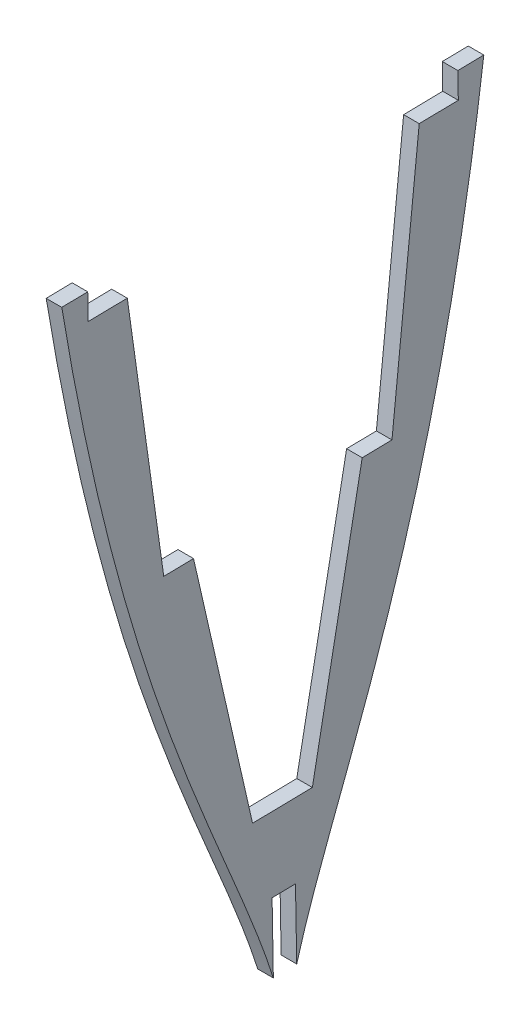
ISO-10303-21;
HEADER;
FILE_DESCRIPTION(('STEP AP214'),'2;1');
FILE_NAME('part.step','',(''),(''),'','','');
FILE_SCHEMA(('AUTOMOTIVE_DESIGN { 1 0 10303 214 1 1 1 1 }'));
ENDSEC;
DATA;
#1=APPLICATION_CONTEXT('core data for automotive mechanical design processes');
#2=APPLICATION_PROTOCOL_DEFINITION('international standard','automotive_design',2000,#1);
#3=PRODUCT_CONTEXT('',#1,'mechanical');
#4=PRODUCT('Part','Part','',(#3));
#5=PRODUCT_RELATED_PRODUCT_CATEGORY('part','',(#4));
#6=PRODUCT_DEFINITION_FORMATION('','',#4);
#7=PRODUCT_DEFINITION_CONTEXT('part definition',#1,'design');
#8=PRODUCT_DEFINITION('design','',#6,#7);
#9=PRODUCT_DEFINITION_SHAPE('','',#8);
#10=(LENGTH_UNIT() NAMED_UNIT(*) SI_UNIT(.MILLI.,.METRE.));
#11=(NAMED_UNIT(*) PLANE_ANGLE_UNIT() SI_UNIT($,.RADIAN.));
#12=(NAMED_UNIT(*) SI_UNIT($,.STERADIAN.) SOLID_ANGLE_UNIT());
#13=UNCERTAINTY_MEASURE_WITH_UNIT(LENGTH_MEASURE(1.E-05),#10,'distance_accuracy_value','');
#14=(GEOMETRIC_REPRESENTATION_CONTEXT(3) GLOBAL_UNCERTAINTY_ASSIGNED_CONTEXT((#13)) GLOBAL_UNIT_ASSIGNED_CONTEXT((#10,
#11,#12)) REPRESENTATION_CONTEXT('',''));
#15=CARTESIAN_POINT('',(0.,0.,0.));
#16=DIRECTION('',(0.,0.,1.));
#17=DIRECTION('',(1.,0.,0.));
#18=AXIS2_PLACEMENT_3D('',#15,#16,#17);
#19=CARTESIAN_POINT('',(6.,89.6041586149967,1.58905888744342));
#20=CARTESIAN_POINT('',(6.,148.754134114083,-8.60867994160897));
#21=CARTESIAN_POINT('',(6.,203.619351527145,-52.3294000676424));
#22=CARTESIAN_POINT('',(6.,374.992738115061,-74.6183258739251));
#23=B_SPLINE_CURVE_WITH_KNOTS('',3,(#19,#20,#21,#22),.UNSPECIFIED.,.F.,.F.,(4,4),(0.,1.),.UNSPECIFIED.);
#24=DIRECTION('',(-1.,0.,0.));
#25=VECTOR('',#24,1.);
#26=SURFACE_OF_LINEAR_EXTRUSION('',#23,#25);
#27=CARTESIAN_POINT('',(6.,107.940325521315,-2.58647126833044));
#28=VERTEX_POINT('',#27);
#29=CARTESIAN_POINT('',(6.,374.992738115061,-74.6183258739251));
#30=VERTEX_POINT('',#29);
#31=EDGE_CURVE('E116',#28,#30,#23,.T.);
#32=ORIENTED_EDGE('',*,*,#31,.F.);
#33=DIRECTION('',(1.,0.,0.));
#34=VECTOR('',#33,1.);
#35=CARTESIAN_POINT('',(0.,107.940325521315,-2.58647126833044));
#36=LINE('',#35,#34);
#37=CARTESIAN_POINT('',(0.,107.940325521315,-2.58647126833044));
#38=VERTEX_POINT('',#37);
#39=EDGE_CURVE('E377',#38,#28,#36,.T.);
#40=ORIENTED_EDGE('',*,*,#39,.F.);
#41=CARTESIAN_POINT('',(0.,89.6041586149967,1.58905888744342));
#42=CARTESIAN_POINT('',(0.,148.754134114083,-8.60867994160897));
#43=CARTESIAN_POINT('',(0.,203.619351527145,-52.3294000676424));
#44=CARTESIAN_POINT('',(0.,374.992738115061,-74.6183258739251));
#45=B_SPLINE_CURVE_WITH_KNOTS('',3,(#41,#42,#43,#44),.UNSPECIFIED.,.F.,.F.,(4,4),(0.,1.),.UNSPECIFIED.);
#46=CARTESIAN_POINT('',(0.,374.992738115061,-74.6183258739251));
#47=VERTEX_POINT('',#46);
#48=EDGE_CURVE('E185',#38,#47,#45,.T.);
#49=ORIENTED_EDGE('',*,*,#48,.T.);
#50=DIRECTION('',(-1.,0.,0.));
#51=VECTOR('',#50,1.);
#52=CARTESIAN_POINT('',(6.,374.992738115061,-74.6183258739251));
#53=LINE('',#52,#51);
#54=EDGE_CURVE('E11',#30,#47,#53,.T.);
#55=ORIENTED_EDGE('',*,*,#54,.F.);
#56=EDGE_LOOP('',(#32,#40,#49,#55));
#57=FACE_BOUND('',#56,.T.);
#58=ADVANCED_FACE('F33',(#57),#26,.F.);
#59=CARTESIAN_POINT('',(6.,374.992738115061,-74.6183258739251));
#60=DIRECTION('',(0.,-0.999842785995474,-0.0177314210600299));
#61=DIRECTION('',(0.,0.0177314210600299,-0.999842785995474));
#62=AXIS2_PLACEMENT_3D('',#59,#60,#61);
#63=PLANE('',#62);
#64=DIRECTION('',(0.,-0.0177314210600299,0.999842785995474));
#65=VECTOR('',#64,1.);
#66=CARTESIAN_POINT('',(0.,374.992738115061,-74.6183258739251));
#67=LINE('',#66,#65);
#68=CARTESIAN_POINT('',(0.,374.815423904461,-64.6198980139703));
#69=VERTEX_POINT('',#68);
#70=EDGE_CURVE('E251',#47,#69,#67,.T.);
#71=ORIENTED_EDGE('',*,*,#70,.T.);
#72=DIRECTION('',(-1.,0.,0.));
#73=VECTOR('',#72,1.);
#74=CARTESIAN_POINT('',(6.,374.815423904461,-64.6198980139703));
#75=LINE('',#74,#73);
#76=CARTESIAN_POINT('',(6.,374.815423904461,-64.6198980139703));
#77=VERTEX_POINT('',#76);
#78=EDGE_CURVE('E41',#77,#69,#75,.T.);
#79=ORIENTED_EDGE('',*,*,#78,.F.);
#80=DIRECTION('',(0.,-0.0177314210600299,0.999842785995474));
#81=VECTOR('',#80,1.);
#82=CARTESIAN_POINT('',(6.,374.992738115061,-74.6183258739251));
#83=LINE('',#82,#81);
#84=EDGE_CURVE('E327',#30,#77,#83,.T.);
#85=ORIENTED_EDGE('',*,*,#84,.F.);
#86=ORIENTED_EDGE('',*,*,#54,.T.);
#87=EDGE_LOOP('',(#71,#79,#85,#86));
#88=FACE_BOUND('',#87,.T.);
#89=ADVANCED_FACE('F241',(#88),#63,.F.);
#90=CARTESIAN_POINT('',(6.,374.815423904461,-64.6198980139703));
#91=DIRECTION('',(0.,0.0177314210600324,-0.999842785995474));
#92=DIRECTION('',(0.,0.999842785995474,0.0177314210600324));
#93=AXIS2_PLACEMENT_3D('',#90,#91,#92);
#94=PLANE('',#93);
#95=DIRECTION('',(0.,-0.999842785995474,-0.0177314210600324));
#96=VECTOR('',#95,1.);
#97=CARTESIAN_POINT('',(0.,374.815423904461,-64.6198980139703));
#98=LINE('',#97,#96);
#99=CARTESIAN_POINT('',(0.,364.815423904461,-64.797240105231));
#100=VERTEX_POINT('',#99);
#101=EDGE_CURVE('E258',#69,#100,#98,.T.);
#102=ORIENTED_EDGE('',*,*,#101,.T.);
#103=DIRECTION('',(-1.,0.,0.));
#104=VECTOR('',#103,1.);
#105=CARTESIAN_POINT('',(6.,364.815423904461,-64.797240105231));
#106=LINE('',#105,#104);
#107=CARTESIAN_POINT('',(6.,364.815423904461,-64.797240105231));
#108=VERTEX_POINT('',#107);
#109=EDGE_CURVE('E262',#108,#100,#106,.T.);
#110=ORIENTED_EDGE('',*,*,#109,.F.);
#111=DIRECTION('',(0.,-0.999842785995474,-0.0177314210600324));
#112=VECTOR('',#111,1.);
#113=CARTESIAN_POINT('',(6.,374.815423904461,-64.6198980139703));
#114=LINE('',#113,#112);
#115=EDGE_CURVE('E261',#77,#108,#114,.T.);
#116=ORIENTED_EDGE('',*,*,#115,.F.);
#117=ORIENTED_EDGE('',*,*,#78,.T.);
#118=EDGE_LOOP('',(#102,#110,#116,#117));
#119=FACE_BOUND('',#118,.T.);
#120=ADVANCED_FACE('F238',(#119),#94,.F.);
#121=CARTESIAN_POINT('',(6.,364.815423904461,-64.797240105231));
#122=DIRECTION('',(0.,-0.999842785995474,-0.01773142106003));
#123=DIRECTION('',(0.,0.01773142106003,-0.999842785995474));
#124=AXIS2_PLACEMENT_3D('',#121,#122,#123);
#125=PLANE('',#124);
#126=DIRECTION('',(0.,-0.01773142106003,0.999842785995474));
#127=VECTOR('',#126,1.);
#128=CARTESIAN_POINT('',(0.,364.815423904461,-64.797240105231));
#129=LINE('',#128,#127);
#130=CARTESIAN_POINT('',(0.,364.548482313517,-49.7448862592683));
#131=VERTEX_POINT('',#130);
#132=EDGE_CURVE('E265',#100,#131,#129,.T.);
#133=ORIENTED_EDGE('',*,*,#132,.T.);
#134=DIRECTION('',(-1.,0.,0.));
#135=VECTOR('',#134,1.);
#136=CARTESIAN_POINT('',(6.,364.548482313517,-49.7448862592683));
#137=LINE('',#136,#135);
#138=CARTESIAN_POINT('',(6.,364.548482313517,-49.7448862592683));
#139=VERTEX_POINT('',#138);
#140=EDGE_CURVE('E316',#139,#131,#137,.T.);
#141=ORIENTED_EDGE('',*,*,#140,.F.);
#142=DIRECTION('',(0.,-0.01773142106003,0.999842785995474));
#143=VECTOR('',#142,1.);
#144=CARTESIAN_POINT('',(6.,364.815423904461,-64.797240105231));
#145=LINE('',#144,#143);
#146=EDGE_CURVE('E321',#108,#139,#145,.T.);
#147=ORIENTED_EDGE('',*,*,#146,.F.);
#148=ORIENTED_EDGE('',*,*,#109,.T.);
#149=EDGE_LOOP('',(#133,#141,#147,#148));
#150=FACE_BOUND('',#149,.T.);
#151=ADVANCED_FACE('F234',(#150),#125,.F.);
#152=CARTESIAN_POINT('',(6.,364.548482313517,-49.7448862592683));
#153=DIRECTION('',(0.,-0.104133257989715,-0.994563353728885));
#154=DIRECTION('',(0.,0.994563353728885,-0.104133257989715));
#155=AXIS2_PLACEMENT_3D('',#152,#153,#154);
#156=PLANE('',#155);
#157=DIRECTION('',(0.,-0.994563353728885,0.104133257989715));
#158=VECTOR('',#157,1.);
#159=CARTESIAN_POINT('',(0.,364.548482313517,-49.7448862592683));
#160=LINE('',#159,#158);
#161=CARTESIAN_POINT('',(0.,264.346702190025,-39.2535105399567));
#162=VERTEX_POINT('',#161);
#163=EDGE_CURVE('E267',#131,#162,#160,.T.);
#164=ORIENTED_EDGE('',*,*,#163,.T.);
#165=DIRECTION('',(-1.,0.,0.));
#166=VECTOR('',#165,1.);
#167=CARTESIAN_POINT('',(6.,264.346702190025,-39.2535105399567));
#168=LINE('',#167,#166);
#169=CARTESIAN_POINT('',(6.,264.346702190025,-39.2535105399567));
#170=VERTEX_POINT('',#169);
#171=EDGE_CURVE('E313',#170,#162,#168,.T.);
#172=ORIENTED_EDGE('',*,*,#171,.F.);
#173=DIRECTION('',(0.,-0.994563353728885,0.104133257989715));
#174=VECTOR('',#173,1.);
#175=CARTESIAN_POINT('',(6.,364.548482313517,-49.7448862592683));
#176=LINE('',#175,#174);
#177=EDGE_CURVE('E323',#139,#170,#176,.T.);
#178=ORIENTED_EDGE('',*,*,#177,.F.);
#179=ORIENTED_EDGE('',*,*,#140,.T.);
#180=EDGE_LOOP('',(#164,#172,#178,#179));
#181=FACE_BOUND('',#180,.T.);
#182=ADVANCED_FACE('F230',(#181),#156,.F.);
#183=CARTESIAN_POINT('',(6.,264.346702190025,-39.2535105399567));
#184=DIRECTION('',(0.,-0.999842785995474,-0.0177314210600326));
#185=DIRECTION('',(0.,0.0177314210600326,-0.999842785995474));
#186=AXIS2_PLACEMENT_3D('',#183,#184,#185);
#187=PLANE('',#186);
#188=DIRECTION('',(0.,-0.0177314210600326,0.999842785995474));
#189=VECTOR('',#188,1.);
#190=CARTESIAN_POINT('',(0.,264.346702190025,-39.2535105399567));
#191=LINE('',#190,#189);
#192=CARTESIAN_POINT('',(0.,264.143438531371,-27.7918402050227));
#193=VERTEX_POINT('',#192);
#194=EDGE_CURVE('E271',#162,#193,#191,.T.);
#195=ORIENTED_EDGE('',*,*,#194,.T.);
#196=DIRECTION('',(-1.,0.,0.));
#197=VECTOR('',#196,1.);
#198=CARTESIAN_POINT('',(6.,264.143438531371,-27.7918402050227));
#199=LINE('',#198,#197);
#200=CARTESIAN_POINT('',(6.,264.143438531371,-27.7918402050227));
#201=VERTEX_POINT('',#200);
#202=EDGE_CURVE('E310',#201,#193,#199,.T.);
#203=ORIENTED_EDGE('',*,*,#202,.F.);
#204=DIRECTION('',(0.,-0.0177314210600326,0.999842785995474));
#205=VECTOR('',#204,1.);
#206=CARTESIAN_POINT('',(6.,264.346702190025,-39.2535105399567));
#207=LINE('',#206,#205);
#208=EDGE_CURVE('E325',#170,#201,#207,.T.);
#209=ORIENTED_EDGE('',*,*,#208,.F.);
#210=ORIENTED_EDGE('',*,*,#171,.T.);
#211=EDGE_LOOP('',(#195,#203,#209,#210));
#212=FACE_BOUND('',#211,.T.);
#213=ADVANCED_FACE('F226',(#212),#187,.F.);
#214=CARTESIAN_POINT('',(6.,264.143438531371,-27.7918402050227));
#215=DIRECTION('',(0.,-0.187751911637469,-0.9822164831016));
#216=DIRECTION('',(0.,0.9822164831016,-0.187751911637469));
#217=AXIS2_PLACEMENT_3D('',#214,#215,#216);
#218=PLANE('',#217);
#219=DIRECTION('',(0.,-0.9822164831016,0.187751911637469));
#220=VECTOR('',#219,1.);
#221=CARTESIAN_POINT('',(0.,264.143438531371,-27.7918402050227));
#222=LINE('',#221,#220);
#223=CARTESIAN_POINT('',(0.,163.787516483096,-8.60867994160897));
#224=VERTEX_POINT('',#223);
#225=EDGE_CURVE('E273',#193,#224,#222,.T.);
#226=ORIENTED_EDGE('',*,*,#225,.T.);
#227=DIRECTION('',(-1.,0.,0.));
#228=VECTOR('',#227,1.);
#229=CARTESIAN_POINT('',(6.,163.787516483096,-8.60867994160897));
#230=LINE('',#229,#228);
#231=CARTESIAN_POINT('',(6.,163.787516483096,-8.60867994160897));
#232=VERTEX_POINT('',#231);
#233=EDGE_CURVE('E307',#232,#224,#230,.T.);
#234=ORIENTED_EDGE('',*,*,#233,.F.);
#235=DIRECTION('',(0.,-0.9822164831016,0.187751911637469));
#236=VECTOR('',#235,1.);
#237=CARTESIAN_POINT('',(6.,264.143438531371,-27.7918402050227));
#238=LINE('',#237,#236);
#239=EDGE_CURVE('E332',#201,#232,#238,.T.);
#240=ORIENTED_EDGE('',*,*,#239,.F.);
#241=ORIENTED_EDGE('',*,*,#202,.T.);
#242=EDGE_LOOP('',(#226,#234,#240,#241));
#243=FACE_BOUND('',#242,.T.);
#244=ADVANCED_FACE('F222',(#243),#218,.F.);
#245=CARTESIAN_POINT('',(6.,163.787516483096,-8.60867994160897));
#246=DIRECTION('',(0.,-0.999842785995474,-0.0177314210600294));
#247=DIRECTION('',(0.,0.0177314210600294,-0.999842785995474));
#248=AXIS2_PLACEMENT_3D('',#245,#246,#247);
#249=PLANE('',#248);
#250=DIRECTION('',(0.,-0.0177314210600294,0.999842785995474));
#251=VECTOR('',#250,1.);
#252=CARTESIAN_POINT('',(0.,163.787516483096,-8.60867994160897));
#253=LINE('',#252,#251);
#254=CARTESIAN_POINT('',(0.,163.379285552047,14.410724428006));
#255=VERTEX_POINT('',#254);
#256=EDGE_CURVE('E275',#224,#255,#253,.T.);
#257=ORIENTED_EDGE('',*,*,#256,.T.);
#258=DIRECTION('',(-1.,0.,0.));
#259=VECTOR('',#258,1.);
#260=CARTESIAN_POINT('',(6.,163.379285552047,14.410724428006));
#261=LINE('',#260,#259);
#262=CARTESIAN_POINT('',(6.,163.379285552047,14.410724428006));
#263=VERTEX_POINT('',#262);
#264=EDGE_CURVE('E304',#263,#255,#261,.T.);
#265=ORIENTED_EDGE('',*,*,#264,.F.);
#266=DIRECTION('',(0.,-0.0177314210600294,0.999842785995474));
#267=VECTOR('',#266,1.);
#268=CARTESIAN_POINT('',(6.,163.787516483096,-8.60867994160897));
#269=LINE('',#268,#267);
#270=EDGE_CURVE('E334',#232,#263,#269,.T.);
#271=ORIENTED_EDGE('',*,*,#270,.F.);
#272=ORIENTED_EDGE('',*,*,#233,.T.);
#273=EDGE_LOOP('',(#257,#265,#271,#272));
#274=FACE_BOUND('',#273,.T.);
#275=ADVANCED_FACE('F218',(#274),#249,.F.);
#276=CARTESIAN_POINT('',(6.,262.991920702867,37.1401689034259));
#277=DIRECTION('',(0.,-0.222460563959151,0.974941689273249));
#278=DIRECTION('',(0.,-0.974941689273249,-0.222460563959151));
#279=AXIS2_PLACEMENT_3D('',#276,#277,#278);
#280=PLANE('',#279);
#281=DIRECTION('',(0.,0.974941689273249,0.222460563959151));
#282=VECTOR('',#281,1.);
#283=CARTESIAN_POINT('',(0.,262.991920702867,37.1401689034259));
#284=LINE('',#283,#282);
#285=CARTESIAN_POINT('',(0.,262.991920702867,37.1401689034259));
#286=VERTEX_POINT('',#285);
#287=EDGE_CURVE('E277',#255,#286,#284,.T.);
#288=ORIENTED_EDGE('',*,*,#287,.T.);
#289=DIRECTION('',(-1.,0.,0.));
#290=VECTOR('',#289,1.);
#291=CARTESIAN_POINT('',(6.,262.991920702867,37.1401689034259));
#292=LINE('',#291,#290);
#293=CARTESIAN_POINT('',(6.,262.991920702867,37.1401689034259));
#294=VERTEX_POINT('',#293);
#295=EDGE_CURVE('E301',#294,#286,#292,.T.);
#296=ORIENTED_EDGE('',*,*,#295,.F.);
#297=DIRECTION('',(0.,0.974941689273249,0.222460563959151));
#298=VECTOR('',#297,1.);
#299=CARTESIAN_POINT('',(6.,262.991920702867,37.1401689034259));
#300=LINE('',#299,#298);
#301=EDGE_CURVE('E336',#263,#294,#300,.T.);
#302=ORIENTED_EDGE('',*,*,#301,.F.);
#303=ORIENTED_EDGE('',*,*,#264,.T.);
#304=EDGE_LOOP('',(#288,#296,#302,#303));
#305=FACE_BOUND('',#304,.T.);
#306=ADVANCED_FACE('F214',(#305),#280,.F.);
#307=CARTESIAN_POINT('',(6.,262.788657044213,48.60183923836));
#308=DIRECTION('',(0.,-0.999842785995474,-0.0177314210600326));
#309=DIRECTION('',(0.,0.0177314210600326,-0.999842785995474));
#310=AXIS2_PLACEMENT_3D('',#307,#308,#309);
#311=PLANE('',#310);
#312=DIRECTION('',(0.,-0.0177314210600326,0.999842785995474));
#313=VECTOR('',#312,1.);
#314=CARTESIAN_POINT('',(0.,262.788657044213,48.60183923836));
#315=LINE('',#314,#313);
#316=CARTESIAN_POINT('',(0.,262.788657044213,48.60183923836));
#317=VERTEX_POINT('',#316);
#318=EDGE_CURVE('E279',#286,#317,#315,.T.);
#319=ORIENTED_EDGE('',*,*,#318,.T.);
#320=DIRECTION('',(-1.,0.,0.));
#321=VECTOR('',#320,1.);
#322=CARTESIAN_POINT('',(6.,262.788657044213,48.60183923836));
#323=LINE('',#322,#321);
#324=CARTESIAN_POINT('',(6.,262.788657044213,48.60183923836));
#325=VERTEX_POINT('',#324);
#326=EDGE_CURVE('E298',#325,#317,#323,.T.);
#327=ORIENTED_EDGE('',*,*,#326,.F.);
#328=DIRECTION('',(0.,-0.0177314210600326,0.999842785995474));
#329=VECTOR('',#328,1.);
#330=CARTESIAN_POINT('',(6.,262.788657044213,48.60183923836));
#331=LINE('',#330,#329);
#332=EDGE_CURVE('E338',#294,#325,#331,.T.);
#333=ORIENTED_EDGE('',*,*,#332,.F.);
#334=ORIENTED_EDGE('',*,*,#295,.T.);
#335=EDGE_LOOP('',(#319,#327,#333,#334));
#336=FACE_BOUND('',#335,.T.);
#337=ADVANCED_FACE('F210',(#336),#311,.F.);
#338=CARTESIAN_POINT('',(6.,362.555434119816,62.6394991696776));
#339=DIRECTION('',(0.,-0.139332276558265,0.990245685024222));
#340=DIRECTION('',(0.,-0.990245685024222,-0.139332276558265));
#341=AXIS2_PLACEMENT_3D('',#338,#339,#340);
#342=PLANE('',#341);
#343=DIRECTION('',(0.,0.990245685024222,0.139332276558265));
#344=VECTOR('',#343,1.);
#345=CARTESIAN_POINT('',(0.,362.555434119816,62.6394991696776));
#346=LINE('',#345,#344);
#347=CARTESIAN_POINT('',(0.,362.555434119816,62.6394991696776));
#348=VERTEX_POINT('',#347);
#349=EDGE_CURVE('E281',#317,#348,#346,.T.);
#350=ORIENTED_EDGE('',*,*,#349,.T.);
#351=DIRECTION('',(-1.,0.,0.));
#352=VECTOR('',#351,1.);
#353=CARTESIAN_POINT('',(6.,362.555434119816,62.6394991696776));
#354=LINE('',#353,#352);
#355=CARTESIAN_POINT('',(6.,362.555434119816,62.6394991696776));
#356=VERTEX_POINT('',#355);
#357=EDGE_CURVE('E171',#356,#348,#354,.T.);
#358=ORIENTED_EDGE('',*,*,#357,.F.);
#359=DIRECTION('',(0.,0.990245685024222,0.139332276558265));
#360=VECTOR('',#359,1.);
#361=CARTESIAN_POINT('',(6.,362.555434119816,62.6394991696776));
#362=LINE('',#361,#360);
#363=EDGE_CURVE('E159',#325,#356,#362,.T.);
#364=ORIENTED_EDGE('',*,*,#363,.F.);
#365=ORIENTED_EDGE('',*,*,#326,.T.);
#366=EDGE_LOOP('',(#350,#358,#364,#365));
#367=FACE_BOUND('',#366,.T.);
#368=ADVANCED_FACE('F207',(#367),#342,.F.);
#369=CARTESIAN_POINT('',(6.,362.288492528872,77.6918530156404));
#370=DIRECTION('',(0.,-0.999842785995474,-0.0177314210600374));
#371=DIRECTION('',(0.,0.0177314210600374,-0.999842785995474));
#372=AXIS2_PLACEMENT_3D('',#369,#370,#371);
#373=PLANE('',#372);
#374=DIRECTION('',(0.,-0.0177314210600374,0.999842785995474));
#375=VECTOR('',#374,1.);
#376=CARTESIAN_POINT('',(0.,362.288492528872,77.6918530156404));
#377=LINE('',#376,#375);
#378=CARTESIAN_POINT('',(0.,362.288492528872,77.6918530156404));
#379=VERTEX_POINT('',#378);
#380=EDGE_CURVE('E168',#348,#379,#377,.T.);
#381=ORIENTED_EDGE('',*,*,#380,.T.);
#382=DIRECTION('',(-1.,0.,0.));
#383=VECTOR('',#382,1.);
#384=CARTESIAN_POINT('',(6.,362.288492528872,77.6918530156404));
#385=LINE('',#384,#383);
#386=CARTESIAN_POINT('',(6.,362.288492528872,77.6918530156404));
#387=VERTEX_POINT('',#386);
#388=EDGE_CURVE('E165',#387,#379,#385,.T.);
#389=ORIENTED_EDGE('',*,*,#388,.F.);
#390=DIRECTION('',(0.,-0.0177314210600374,0.999842785995474));
#391=VECTOR('',#390,1.);
#392=CARTESIAN_POINT('',(6.,362.288492528872,77.6918530156404));
#393=LINE('',#392,#391);
#394=EDGE_CURVE('E151',#356,#387,#393,.T.);
#395=ORIENTED_EDGE('',*,*,#394,.F.);
#396=ORIENTED_EDGE('',*,*,#357,.T.);
#397=EDGE_LOOP('',(#381,#389,#395,#396));
#398=FACE_BOUND('',#397,.T.);
#399=ADVANCED_FACE('F166',(#398),#373,.F.);
#400=CARTESIAN_POINT('',(6.,372.288492528872,77.869195106901));
#401=DIRECTION('',(0.,-0.0177314210600269,0.999842785995474));
#402=DIRECTION('',(0.,-0.999842785995474,-0.0177314210600269));
#403=AXIS2_PLACEMENT_3D('',#400,#401,#402);
#404=PLANE('',#403);
#405=DIRECTION('',(0.,0.999842785995475,0.0177314210600269));
#406=VECTOR('',#405,1.);
#407=CARTESIAN_POINT('',(0.,372.288492528872,77.869195106901));
#408=LINE('',#407,#406);
#409=CARTESIAN_POINT('',(0.,372.288492528872,77.869195106901));
#410=VERTEX_POINT('',#409);
#411=EDGE_CURVE('E284',#379,#410,#408,.T.);
#412=ORIENTED_EDGE('',*,*,#411,.T.);
#413=DIRECTION('',(-1.,0.,0.));
#414=VECTOR('',#413,1.);
#415=CARTESIAN_POINT('',(6.,372.288492528872,77.869195106901));
#416=LINE('',#415,#414);
#417=CARTESIAN_POINT('',(6.,372.288492528872,77.869195106901));
#418=VERTEX_POINT('',#417);
#419=EDGE_CURVE('E172',#418,#410,#416,.T.);
#420=ORIENTED_EDGE('',*,*,#419,.F.);
#421=DIRECTION('',(0.,0.999842785995475,0.0177314210600269));
#422=VECTOR('',#421,1.);
#423=CARTESIAN_POINT('',(6.,372.288492528872,77.869195106901));
#424=LINE('',#423,#422);
#425=EDGE_CURVE('E156',#387,#418,#424,.T.);
#426=ORIENTED_EDGE('',*,*,#425,.F.);
#427=ORIENTED_EDGE('',*,*,#388,.T.);
#428=EDGE_LOOP('',(#412,#420,#426,#427));
#429=FACE_BOUND('',#428,.T.);
#430=ADVANCED_FACE('F174',(#429),#404,.F.);
#431=CARTESIAN_POINT('',(6.,372.111178318272,87.8676229668557));
#432=DIRECTION('',(0.,-0.999842785995474,-0.0177314210600299));
#433=DIRECTION('',(0.,0.0177314210600299,-0.999842785995474));
#434=AXIS2_PLACEMENT_3D('',#431,#432,#433);
#435=PLANE('',#434);
#436=DIRECTION('',(0.,-0.0177314210600299,0.999842785995474));
#437=VECTOR('',#436,1.);
#438=CARTESIAN_POINT('',(0.,372.111178318272,87.8676229668557));
#439=LINE('',#438,#437);
#440=CARTESIAN_POINT('',(0.,372.111178318272,87.8676229668557));
#441=VERTEX_POINT('',#440);
#442=EDGE_CURVE('E108',#410,#441,#439,.T.);
#443=ORIENTED_EDGE('',*,*,#442,.T.);
#444=DIRECTION('',(-1.,0.,0.));
#445=VECTOR('',#444,1.);
#446=CARTESIAN_POINT('',(6.,372.111178318272,87.8676229668557));
#447=LINE('',#446,#445);
#448=CARTESIAN_POINT('',(6.,372.111178318272,87.8676229668557));
#449=VERTEX_POINT('',#448);
#450=EDGE_CURVE('E184',#449,#441,#447,.T.);
#451=ORIENTED_EDGE('',*,*,#450,.F.);
#452=DIRECTION('',(0.,-0.0177314210600299,0.999842785995474));
#453=VECTOR('',#452,1.);
#454=CARTESIAN_POINT('',(6.,372.111178318272,87.8676229668557));
#455=LINE('',#454,#453);
#456=EDGE_CURVE('E57',#418,#449,#455,.T.);
#457=ORIENTED_EDGE('',*,*,#456,.F.);
#458=ORIENTED_EDGE('',*,*,#419,.T.);
#459=EDGE_LOOP('',(#443,#451,#457,#458));
#460=FACE_BOUND('',#459,.T.);
#461=ADVANCED_FACE('F197',(#460),#435,.F.);
#462=CARTESIAN_POINT('',(6.,372.111178318272,87.8676229668557));
#463=CARTESIAN_POINT('',(6.,201.635856834881,59.5162806821615));
#464=CARTESIAN_POINT('',(6.,148.355356272873,13.8776817774697));
#465=CARTESIAN_POINT('',(6.,89.6041586149967,1.58905888744342));
#466=B_SPLINE_CURVE_WITH_KNOTS('',3,(#462,#463,#464,#465),.UNSPECIFIED.,.F.,.F.,(4,4),(0.,1.),.UNSPECIFIED.);
#467=DIRECTION('',(-1.,0.,0.));
#468=VECTOR('',#467,1.);
#469=SURFACE_OF_LINEAR_EXTRUSION('',#466,#468);
#470=CARTESIAN_POINT('',(0.,372.111178318272,87.8676229668557));
#471=CARTESIAN_POINT('',(0.,201.635856834881,59.5162806821615));
#472=CARTESIAN_POINT('',(0.,148.355356272873,13.8776817774697));
#473=CARTESIAN_POINT('',(0.,89.6041586149967,1.58905888744342));
#474=B_SPLINE_CURVE_WITH_KNOTS('',3,(#470,#471,#472,#473),.UNSPECIFIED.,.F.,.F.,(4,4),(0.,1.),.UNSPECIFIED.);
#475=CARTESIAN_POINT('',(0.,107.780742731775,6.41211380562883));
#476=VERTEX_POINT('',#475);
#477=EDGE_CURVE('E287',#441,#476,#474,.T.);
#478=ORIENTED_EDGE('',*,*,#477,.T.);
#479=DIRECTION('',(1.,0.,0.));
#480=VECTOR('',#479,1.);
#481=CARTESIAN_POINT('',(0.,107.780742731775,6.41211380562883));
#482=LINE('',#481,#480);
#483=CARTESIAN_POINT('',(6.,107.780742731775,6.41211380562883));
#484=VERTEX_POINT('',#483);
#485=EDGE_CURVE('E349',#476,#484,#482,.T.);
#486=ORIENTED_EDGE('',*,*,#485,.T.);
#487=EDGE_CURVE('E176',#449,#484,#466,.T.);
#488=ORIENTED_EDGE('',*,*,#487,.F.);
#489=ORIENTED_EDGE('',*,*,#450,.T.);
#490=EDGE_LOOP('',(#478,#486,#488,#489));
#491=FACE_BOUND('',#490,.T.);
#492=ADVANCED_FACE('F193',(#491),#469,.F.);
#493=CARTESIAN_POINT('',(6.,190.214669206718,-31.9804383767795));
#494=DIRECTION('',(1.,0.,0.));
#495=DIRECTION('',(0.,0.,-1.));
#496=AXIS2_PLACEMENT_3D('',#493,#494,#495);
#497=PLANE('',#496);
#498=DIRECTION('',(0.,-0.999842785995474,-0.0177314210600297));
#499=VECTOR('',#498,1.);
#500=CARTESIAN_POINT('',(6.,107.780742731775,6.41211380562883));
#501=LINE('',#500,#499);
#502=CARTESIAN_POINT('',(6.,134.776497953653,6.89086217424963));
#503=VERTEX_POINT('',#502);
#504=EDGE_CURVE('E353',#503,#484,#501,.T.);
#505=ORIENTED_EDGE('',*,*,#504,.F.);
#506=DIRECTION('',(0.,-0.0177314210600287,0.999842785995474));
#507=VECTOR('',#506,1.);
#508=CARTESIAN_POINT('',(6.,134.776497953653,6.89086217424963));
#509=LINE('',#508,#507);
#510=CARTESIAN_POINT('',(6.,134.936080743193,-2.10772289970965));
#511=VERTEX_POINT('',#510);
#512=EDGE_CURVE('E371',#511,#503,#509,.T.);
#513=ORIENTED_EDGE('',*,*,#512,.F.);
#514=DIRECTION('',(0.,0.999842785995474,0.0177314210600295));
#515=VECTOR('',#514,1.);
#516=CARTESIAN_POINT('',(6.,134.936080743193,-2.10772289970965));
#517=LINE('',#516,#515);
#518=EDGE_CURVE('E384',#28,#511,#517,.T.);
#519=ORIENTED_EDGE('',*,*,#518,.F.);
#520=ORIENTED_EDGE('',*,*,#31,.T.);
#521=ORIENTED_EDGE('',*,*,#84,.T.);
#522=ORIENTED_EDGE('',*,*,#115,.T.);
#523=ORIENTED_EDGE('',*,*,#146,.T.);
#524=ORIENTED_EDGE('',*,*,#177,.T.);
#525=ORIENTED_EDGE('',*,*,#208,.T.);
#526=ORIENTED_EDGE('',*,*,#239,.T.);
#527=ORIENTED_EDGE('',*,*,#270,.T.);
#528=ORIENTED_EDGE('',*,*,#301,.T.);
#529=ORIENTED_EDGE('',*,*,#332,.T.);
#530=ORIENTED_EDGE('',*,*,#363,.T.);
#531=ORIENTED_EDGE('',*,*,#394,.T.);
#532=ORIENTED_EDGE('',*,*,#425,.T.);
#533=ORIENTED_EDGE('',*,*,#456,.T.);
#534=ORIENTED_EDGE('',*,*,#487,.T.);
#535=EDGE_LOOP('',(#505,#513,#519,#520,#521,#522,#523,#524,#525,#526,#527,#528,#529,#530,#531,
#532,#533,#534));
#536=FACE_BOUND('',#535,.T.);
#537=ADVANCED_FACE('F154',(#536),#497,.T.);
#538=CARTESIAN_POINT('',(0.,190.214669206718,-31.9804383767795));
#539=DIRECTION('',(1.,0.,0.));
#540=DIRECTION('',(0.,0.,-1.));
#541=AXIS2_PLACEMENT_3D('',#538,#539,#540);
#542=PLANE('',#541);
#543=DIRECTION('',(0.,-0.0177314210600287,0.999842785995474));
#544=VECTOR('',#543,1.);
#545=CARTESIAN_POINT('',(0.,134.776497953653,6.89086217424963));
#546=LINE('',#545,#544);
#547=CARTESIAN_POINT('',(0.,134.936080743193,-2.10772289970964));
#548=VERTEX_POINT('',#547);
#549=CARTESIAN_POINT('',(0.,134.776497953653,6.89086217424963));
#550=VERTEX_POINT('',#549);
#551=EDGE_CURVE('E48',#548,#550,#546,.T.);
#552=ORIENTED_EDGE('',*,*,#551,.T.);
#553=DIRECTION('',(0.,-0.999842785995474,-0.0177314210600297));
#554=VECTOR('',#553,1.);
#555=CARTESIAN_POINT('',(0.,107.780742731775,6.41211380562883));
#556=LINE('',#555,#554);
#557=EDGE_CURVE('E375',#550,#476,#556,.T.);
#558=ORIENTED_EDGE('',*,*,#557,.T.);
#559=ORIENTED_EDGE('',*,*,#477,.F.);
#560=ORIENTED_EDGE('',*,*,#442,.F.);
#561=ORIENTED_EDGE('',*,*,#411,.F.);
#562=ORIENTED_EDGE('',*,*,#380,.F.);
#563=ORIENTED_EDGE('',*,*,#349,.F.);
#564=ORIENTED_EDGE('',*,*,#318,.F.);
#565=ORIENTED_EDGE('',*,*,#287,.F.);
#566=ORIENTED_EDGE('',*,*,#256,.F.);
#567=ORIENTED_EDGE('',*,*,#225,.F.);
#568=ORIENTED_EDGE('',*,*,#194,.F.);
#569=ORIENTED_EDGE('',*,*,#163,.F.);
#570=ORIENTED_EDGE('',*,*,#132,.F.);
#571=ORIENTED_EDGE('',*,*,#101,.F.);
#572=ORIENTED_EDGE('',*,*,#70,.F.);
#573=ORIENTED_EDGE('',*,*,#48,.F.);
#574=DIRECTION('',(0.,0.999842785995474,0.0177314210600295));
#575=VECTOR('',#574,1.);
#576=CARTESIAN_POINT('',(0.,134.936080743193,-2.10772289970965));
#577=LINE('',#576,#575);
#578=EDGE_CURVE('E380',#38,#548,#577,.T.);
#579=ORIENTED_EDGE('',*,*,#578,.T.);
#580=EDGE_LOOP('',(#552,#558,#559,#560,#561,#562,#563,#564,#565,#566,#567,#568,#569,#570,#571,
#572,#573,#579));
#581=FACE_BOUND('',#580,.T.);
#582=ADVANCED_FACE('F199',(#581),#542,.F.);
#583=CARTESIAN_POINT('',(0.,107.780742731775,6.41211380562883));
#584=DIRECTION('',(0.,-0.0177314210600297,0.999842785995474));
#585=DIRECTION('',(0.,-0.999842785995474,-0.0177314210600297));
#586=AXIS2_PLACEMENT_3D('',#583,#584,#585);
#587=PLANE('',#586);
#588=ORIENTED_EDGE('',*,*,#504,.T.);
#589=ORIENTED_EDGE('',*,*,#485,.F.);
#590=ORIENTED_EDGE('',*,*,#557,.F.);
#591=DIRECTION('',(1.,0.,0.));
#592=VECTOR('',#591,1.);
#593=CARTESIAN_POINT('',(0.,134.776497953653,6.89086217424963));
#594=LINE('',#593,#592);
#595=EDGE_CURVE('E362',#550,#503,#594,.T.);
#596=ORIENTED_EDGE('',*,*,#595,.T.);
#597=EDGE_LOOP('',(#588,#589,#590,#596));
#598=FACE_BOUND('',#597,.T.);
#599=ADVANCED_FACE('F376',(#598),#587,.F.);
#600=CARTESIAN_POINT('',(0.,134.776497953653,6.89086217424963));
#601=DIRECTION('',(0.,0.999842785995474,0.0177314210600287));
#602=DIRECTION('',(0.,-0.0177314210600287,0.999842785995474));
#603=AXIS2_PLACEMENT_3D('',#600,#601,#602);
#604=PLANE('',#603);
#605=ORIENTED_EDGE('',*,*,#512,.T.);
#606=ORIENTED_EDGE('',*,*,#595,.F.);
#607=ORIENTED_EDGE('',*,*,#551,.F.);
#608=DIRECTION('',(1.,0.,0.));
#609=VECTOR('',#608,1.);
#610=CARTESIAN_POINT('',(0.,134.936080743193,-2.10772289970965));
#611=LINE('',#610,#609);
#612=EDGE_CURVE('E372',#548,#511,#611,.T.);
#613=ORIENTED_EDGE('',*,*,#612,.T.);
#614=EDGE_LOOP('',(#605,#606,#607,#613));
#615=FACE_BOUND('',#614,.T.);
#616=ADVANCED_FACE('F370',(#615),#604,.F.);
#617=CARTESIAN_POINT('',(0.,134.936080743193,-2.10772289970965));
#618=DIRECTION('',(0.,0.0177314210600295,-0.999842785995474));
#619=DIRECTION('',(0.,0.999842785995474,0.0177314210600295));
#620=AXIS2_PLACEMENT_3D('',#617,#618,#619);
#621=PLANE('',#620);
#622=ORIENTED_EDGE('',*,*,#518,.T.);
#623=ORIENTED_EDGE('',*,*,#612,.F.);
#624=ORIENTED_EDGE('',*,*,#578,.F.);
#625=ORIENTED_EDGE('',*,*,#39,.T.);
#626=EDGE_LOOP('',(#622,#623,#624,#625));
#627=FACE_BOUND('',#626,.T.);
#628=ADVANCED_FACE('F399',(#627),#621,.F.);
#629=CLOSED_SHELL('',(#58,#89,#120,#151,#182,#213,#244,#275,#306,#337,#368,#399,#430,#461,#492,
#537,#582,#599,#616,#628));
#630=MANIFOLD_SOLID_BREP('B2',#629);
#631=ADVANCED_BREP_SHAPE_REPRESENTATION('',(#18,#630),#14);
#632=SHAPE_DEFINITION_REPRESENTATION(#9,#631);
ENDSEC;
END-ISO-10303-21;
